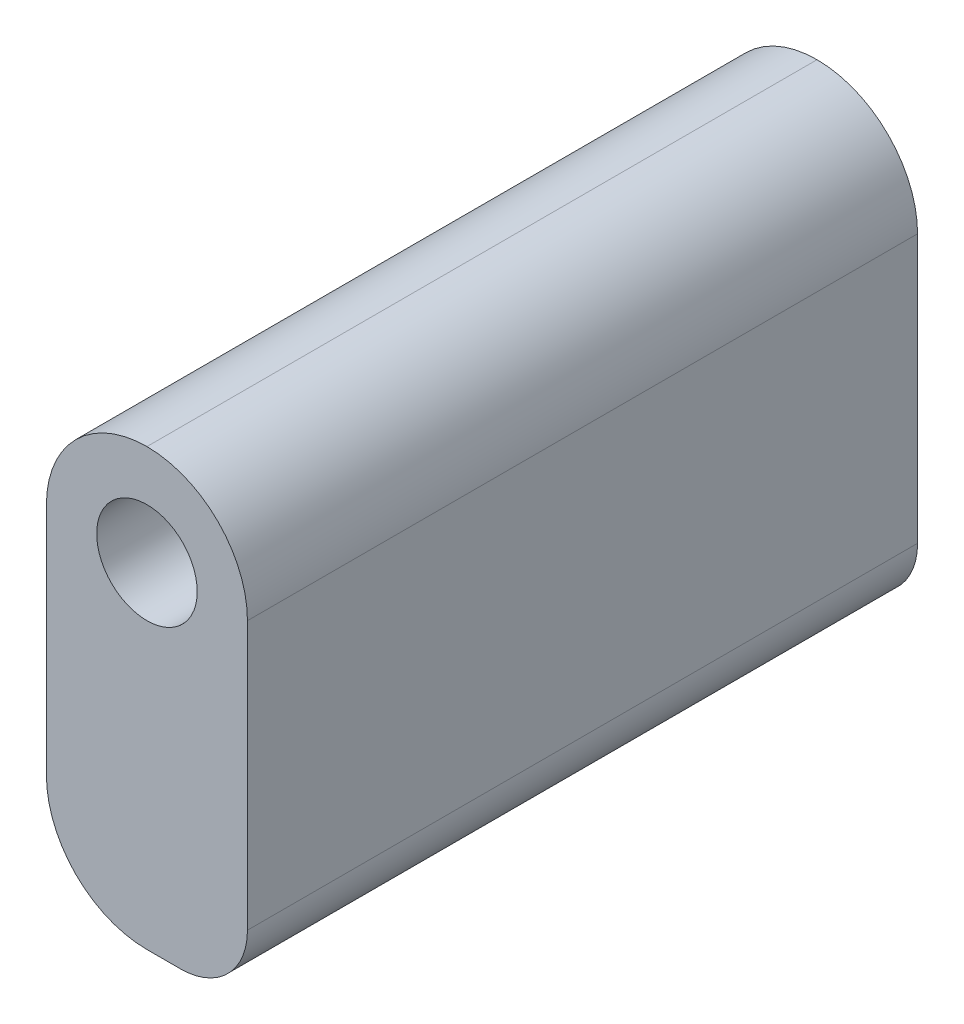
ISO-10303-21;
HEADER;
FILE_DESCRIPTION(('STEP AP214'),'2;1');
FILE_NAME('part.step','',(''),(''),'','','');
FILE_SCHEMA(('AUTOMOTIVE_DESIGN { 1 0 10303 214 1 1 1 1 }'));
ENDSEC;
DATA;
#1=APPLICATION_CONTEXT('core data for automotive mechanical design processes');
#2=APPLICATION_PROTOCOL_DEFINITION('international standard','automotive_design',2000,#1);
#3=PRODUCT_CONTEXT('',#1,'mechanical');
#4=PRODUCT('Part','Part','',(#3));
#5=PRODUCT_RELATED_PRODUCT_CATEGORY('part','',(#4));
#6=PRODUCT_DEFINITION_FORMATION('','',#4);
#7=PRODUCT_DEFINITION_CONTEXT('part definition',#1,'design');
#8=PRODUCT_DEFINITION('design','',#6,#7);
#9=PRODUCT_DEFINITION_SHAPE('','',#8);
#10=(LENGTH_UNIT() NAMED_UNIT(*) SI_UNIT(.MILLI.,.METRE.));
#11=(NAMED_UNIT(*) PLANE_ANGLE_UNIT() SI_UNIT($,.RADIAN.));
#12=(NAMED_UNIT(*) SI_UNIT($,.STERADIAN.) SOLID_ANGLE_UNIT());
#13=UNCERTAINTY_MEASURE_WITH_UNIT(LENGTH_MEASURE(1.E-05),#10,'distance_accuracy_value','');
#14=(GEOMETRIC_REPRESENTATION_CONTEXT(3) GLOBAL_UNCERTAINTY_ASSIGNED_CONTEXT((#13)) GLOBAL_UNIT_ASSIGNED_CONTEXT((#10,
#11,#12)) REPRESENTATION_CONTEXT('',''));
#15=CARTESIAN_POINT('',(0.,0.,0.));
#16=DIRECTION('',(0.,0.,1.));
#17=DIRECTION('',(1.,0.,0.));
#18=AXIS2_PLACEMENT_3D('',#15,#16,#17);
#19=CARTESIAN_POINT('',(0.,0.,20.));
#20=DIRECTION('',(0.,0.,1.));
#21=DIRECTION('',(1.,0.,0.));
#22=AXIS2_PLACEMENT_3D('',#19,#20,#21);
#23=PLANE('',#22);
#24=DIRECTION('',(1.,0.,0.));
#25=VECTOR('',#24,1.);
#26=CARTESIAN_POINT('',(-6.,-20.,20.));
#27=LINE('',#26,#25);
#28=CARTESIAN_POINT('',(0.,-20.,20.));
#29=VERTEX_POINT('',#28);
#30=CARTESIAN_POINT('',(2.,-20.,20.));
#31=VERTEX_POINT('',#30);
#32=EDGE_CURVE('E111',#29,#31,#27,.T.);
#33=ORIENTED_EDGE('',*,*,#32,.T.);
#34=CARTESIAN_POINT('',(2.,-16.,20.));
#35=DIRECTION('',(0.,0.,1.));
#36=DIRECTION('',(1.,0.,0.));
#37=AXIS2_PLACEMENT_3D('',#34,#35,#36);
#38=CIRCLE('',#37,4.);
#39=CARTESIAN_POINT('',(6.,-16.,20.));
#40=VERTEX_POINT('',#39);
#41=EDGE_CURVE('E11',#31,#40,#38,.T.);
#42=ORIENTED_EDGE('',*,*,#41,.T.);
#43=DIRECTION('',(0.,1.,0.));
#44=VECTOR('',#43,1.);
#45=CARTESIAN_POINT('',(6.,-20.,20.));
#46=LINE('',#45,#44);
#47=CARTESIAN_POINT('',(6.,0.,20.));
#48=VERTEX_POINT('',#47);
#49=EDGE_CURVE('E113',#40,#48,#46,.T.);
#50=ORIENTED_EDGE('',*,*,#49,.T.);
#51=CARTESIAN_POINT('',(0.,0.,20.));
#52=DIRECTION('',(0.,0.,1.));
#53=DIRECTION('',(1.,0.,0.));
#54=AXIS2_PLACEMENT_3D('',#51,#52,#53);
#55=CIRCLE('',#54,6.);
#56=CARTESIAN_POINT('',(0.,6.,20.));
#57=VERTEX_POINT('',#56);
#58=EDGE_CURVE('E133',#48,#57,#55,.T.);
#59=ORIENTED_EDGE('',*,*,#58,.T.);
#60=CARTESIAN_POINT('',(0.,0.,20.));
#61=DIRECTION('',(0.,0.,1.));
#62=DIRECTION('',(1.,0.,0.));
#63=AXIS2_PLACEMENT_3D('',#60,#61,#62);
#64=CIRCLE('',#63,6.);
#65=CARTESIAN_POINT('',(-6.,0.,20.));
#66=VERTEX_POINT('',#65);
#67=EDGE_CURVE('E131',#57,#66,#64,.T.);
#68=ORIENTED_EDGE('',*,*,#67,.T.);
#69=DIRECTION('',(0.,-1.,0.));
#70=VECTOR('',#69,1.);
#71=CARTESIAN_POINT('',(-6.,6.,20.));
#72=LINE('',#71,#70);
#73=CARTESIAN_POINT('',(-6.,-14.,20.));
#74=VERTEX_POINT('',#73);
#75=EDGE_CURVE('E120',#66,#74,#72,.T.);
#76=ORIENTED_EDGE('',*,*,#75,.T.);
#77=CARTESIAN_POINT('',(0.,-14.,20.));
#78=DIRECTION('',(0.,0.,1.));
#79=DIRECTION('',(1.,0.,0.));
#80=AXIS2_PLACEMENT_3D('',#77,#78,#79);
#81=CIRCLE('',#80,6.);
#82=EDGE_CURVE('E135',#74,#29,#81,.T.);
#83=ORIENTED_EDGE('',*,*,#82,.T.);
#84=EDGE_LOOP('',(#33,#42,#50,#59,#68,#76,#83));
#85=FACE_BOUND('',#84,.T.);
#86=CARTESIAN_POINT('',(0.,0.,20.));
#87=DIRECTION('',(0.,0.,1.));
#88=DIRECTION('',(1.,0.,0.));
#89=AXIS2_PLACEMENT_3D('',#86,#87,#88);
#90=CIRCLE('',#89,3.);
#91=CARTESIAN_POINT('',(3.,0.,20.));
#92=VERTEX_POINT('',#91);
#93=EDGE_CURVE('E122',#92,#92,#90,.T.);
#94=ORIENTED_EDGE('',*,*,#93,.F.);
#95=EDGE_LOOP('',(#94));
#96=FACE_BOUND('',#95,.T.);
#97=ADVANCED_FACE('F39',(#85,#96),#23,.T.);
#98=CARTESIAN_POINT('',(0.,0.,-20.));
#99=DIRECTION('',(0.,0.,1.));
#100=DIRECTION('',(1.,0.,0.));
#101=AXIS2_PLACEMENT_3D('',#98,#99,#100);
#102=PLANE('',#101);
#103=DIRECTION('',(0.,1.,0.));
#104=VECTOR('',#103,1.);
#105=CARTESIAN_POINT('',(6.,-20.,-20.));
#106=LINE('',#105,#104);
#107=CARTESIAN_POINT('',(6.,-16.,-20.));
#108=VERTEX_POINT('',#107);
#109=CARTESIAN_POINT('',(6.,0.,-20.));
#110=VERTEX_POINT('',#109);
#111=EDGE_CURVE('E117',#108,#110,#106,.T.);
#112=ORIENTED_EDGE('',*,*,#111,.F.);
#113=CARTESIAN_POINT('',(2.,-16.,-20.));
#114=DIRECTION('',(0.,0.,1.));
#115=DIRECTION('',(1.,0.,0.));
#116=AXIS2_PLACEMENT_3D('',#113,#114,#115);
#117=CIRCLE('',#116,4.);
#118=CARTESIAN_POINT('',(2.,-20.,-20.));
#119=VERTEX_POINT('',#118);
#120=EDGE_CURVE('E61',#108,#119,#117,.F.);
#121=ORIENTED_EDGE('',*,*,#120,.T.);
#122=DIRECTION('',(1.,0.,0.));
#123=VECTOR('',#122,1.);
#124=CARTESIAN_POINT('',(-6.,-20.,-20.));
#125=LINE('',#124,#123);
#126=CARTESIAN_POINT('',(0.,-20.,-20.));
#127=VERTEX_POINT('',#126);
#128=EDGE_CURVE('E110',#127,#119,#125,.T.);
#129=ORIENTED_EDGE('',*,*,#128,.F.);
#130=CARTESIAN_POINT('',(0.,-14.,-20.));
#131=DIRECTION('',(0.,0.,1.));
#132=DIRECTION('',(1.,0.,0.));
#133=AXIS2_PLACEMENT_3D('',#130,#131,#132);
#134=CIRCLE('',#133,6.);
#135=CARTESIAN_POINT('',(-6.,-14.,-20.));
#136=VERTEX_POINT('',#135);
#137=EDGE_CURVE('E98',#127,#136,#134,.F.);
#138=ORIENTED_EDGE('',*,*,#137,.T.);
#139=DIRECTION('',(0.,-1.,0.));
#140=VECTOR('',#139,1.);
#141=CARTESIAN_POINT('',(-6.,6.,-20.));
#142=LINE('',#141,#140);
#143=CARTESIAN_POINT('',(-6.,0.,-20.));
#144=VERTEX_POINT('',#143);
#145=EDGE_CURVE('E118',#144,#136,#142,.T.);
#146=ORIENTED_EDGE('',*,*,#145,.F.);
#147=CARTESIAN_POINT('',(0.,0.,-20.));
#148=DIRECTION('',(0.,0.,1.));
#149=DIRECTION('',(1.,0.,0.));
#150=AXIS2_PLACEMENT_3D('',#147,#148,#149);
#151=CIRCLE('',#150,6.);
#152=CARTESIAN_POINT('',(0.,6.,-20.));
#153=VERTEX_POINT('',#152);
#154=EDGE_CURVE('E112',#144,#153,#151,.F.);
#155=ORIENTED_EDGE('',*,*,#154,.T.);
#156=CARTESIAN_POINT('',(0.,0.,-20.));
#157=DIRECTION('',(0.,0.,1.));
#158=DIRECTION('',(1.,0.,0.));
#159=AXIS2_PLACEMENT_3D('',#156,#157,#158);
#160=CIRCLE('',#159,6.);
#161=EDGE_CURVE('E107',#153,#110,#160,.F.);
#162=ORIENTED_EDGE('',*,*,#161,.T.);
#163=EDGE_LOOP('',(#112,#121,#129,#138,#146,#155,#162));
#164=FACE_BOUND('',#163,.T.);
#165=CARTESIAN_POINT('',(0.,0.,-20.));
#166=DIRECTION('',(0.,0.,1.));
#167=DIRECTION('',(1.,0.,0.));
#168=AXIS2_PLACEMENT_3D('',#165,#166,#167);
#169=CIRCLE('',#168,3.);
#170=CARTESIAN_POINT('',(3.,0.,-20.));
#171=VERTEX_POINT('',#170);
#172=EDGE_CURVE('E144',#171,#171,#169,.T.);
#173=ORIENTED_EDGE('',*,*,#172,.T.);
#174=EDGE_LOOP('',(#173));
#175=FACE_BOUND('',#174,.T.);
#176=ADVANCED_FACE('F115',(#164,#175),#102,.F.);
#177=CARTESIAN_POINT('',(-6.,6.,20.));
#178=DIRECTION('',(1.,0.,0.));
#179=DIRECTION('',(0.,1.,0.));
#180=AXIS2_PLACEMENT_3D('',#177,#178,#179);
#181=PLANE('',#180);
#182=ORIENTED_EDGE('',*,*,#145,.T.);
#183=DIRECTION('',(0.,0.,-1.));
#184=VECTOR('',#183,1.);
#185=CARTESIAN_POINT('',(-6.,-14.,20.));
#186=LINE('',#185,#184);
#187=EDGE_CURVE('E103',#136,#74,#186,.F.);
#188=ORIENTED_EDGE('',*,*,#187,.T.);
#189=ORIENTED_EDGE('',*,*,#75,.F.);
#190=DIRECTION('',(0.,0.,-1.));
#191=VECTOR('',#190,1.);
#192=CARTESIAN_POINT('',(-6.,0.,20.));
#193=LINE('',#192,#191);
#194=EDGE_CURVE('E106',#66,#144,#193,.T.);
#195=ORIENTED_EDGE('',*,*,#194,.T.);
#196=EDGE_LOOP('',(#182,#188,#189,#195));
#197=FACE_BOUND('',#196,.T.);
#198=ADVANCED_FACE('F169',(#197),#181,.F.);
#199=CARTESIAN_POINT('',(-6.,-20.,20.));
#200=DIRECTION('',(0.,1.,0.));
#201=DIRECTION('',(0.,0.,1.));
#202=AXIS2_PLACEMENT_3D('',#199,#200,#201);
#203=PLANE('',#202);
#204=ORIENTED_EDGE('',*,*,#128,.T.);
#205=DIRECTION('',(0.,0.,-1.));
#206=VECTOR('',#205,1.);
#207=CARTESIAN_POINT('',(2.,-20.,20.));
#208=LINE('',#207,#206);
#209=EDGE_CURVE('E47',#119,#31,#208,.F.);
#210=ORIENTED_EDGE('',*,*,#209,.T.);
#211=ORIENTED_EDGE('',*,*,#32,.F.);
#212=DIRECTION('',(0.,0.,-1.));
#213=VECTOR('',#212,1.);
#214=CARTESIAN_POINT('',(0.,-20.,20.));
#215=LINE('',#214,#213);
#216=EDGE_CURVE('E102',#29,#127,#215,.T.);
#217=ORIENTED_EDGE('',*,*,#216,.T.);
#218=EDGE_LOOP('',(#204,#210,#211,#217));
#219=FACE_BOUND('',#218,.T.);
#220=ADVANCED_FACE('F109',(#219),#203,.F.);
#221=CARTESIAN_POINT('',(6.,-20.,20.));
#222=DIRECTION('',(-1.,0.,0.));
#223=DIRECTION('',(0.,-1.,0.));
#224=AXIS2_PLACEMENT_3D('',#221,#222,#223);
#225=PLANE('',#224);
#226=ORIENTED_EDGE('',*,*,#49,.F.);
#227=DIRECTION('',(0.,0.,-1.));
#228=VECTOR('',#227,1.);
#229=CARTESIAN_POINT('',(6.,-16.,20.));
#230=LINE('',#229,#228);
#231=EDGE_CURVE('E140',#40,#108,#230,.T.);
#232=ORIENTED_EDGE('',*,*,#231,.T.);
#233=ORIENTED_EDGE('',*,*,#111,.T.);
#234=DIRECTION('',(0.,0.,-1.));
#235=VECTOR('',#234,1.);
#236=CARTESIAN_POINT('',(6.,0.,20.));
#237=LINE('',#236,#235);
#238=EDGE_CURVE('E137',#110,#48,#237,.F.);
#239=ORIENTED_EDGE('',*,*,#238,.T.);
#240=EDGE_LOOP('',(#226,#232,#233,#239));
#241=FACE_BOUND('',#240,.T.);
#242=ADVANCED_FACE('F150',(#241),#225,.F.);
#243=CARTESIAN_POINT('',(0.,0.,20.));
#244=DIRECTION('',(0.,0.,-1.));
#245=DIRECTION('',(-1.,0.,0.));
#246=AXIS2_PLACEMENT_3D('',#243,#244,#245);
#247=CYLINDRICAL_SURFACE('',#246,3.);
#248=ORIENTED_EDGE('',*,*,#93,.T.);
#249=EDGE_LOOP('',(#248));
#250=FACE_BOUND('',#249,.T.);
#251=ORIENTED_EDGE('',*,*,#172,.F.);
#252=EDGE_LOOP('',(#251));
#253=FACE_BOUND('',#252,.T.);
#254=ADVANCED_FACE('F178',(#250,#253),#247,.F.);
#255=CARTESIAN_POINT('',(0.,-14.,20.));
#256=DIRECTION('',(0.,0.,-1.));
#257=DIRECTION('',(-1.,0.,0.));
#258=AXIS2_PLACEMENT_3D('',#255,#256,#257);
#259=CYLINDRICAL_SURFACE('',#258,6.);
#260=ORIENTED_EDGE('',*,*,#82,.F.);
#261=ORIENTED_EDGE('',*,*,#187,.F.);
#262=ORIENTED_EDGE('',*,*,#137,.F.);
#263=ORIENTED_EDGE('',*,*,#216,.F.);
#264=EDGE_LOOP('',(#260,#261,#262,#263));
#265=FACE_BOUND('',#264,.T.);
#266=ADVANCED_FACE('F101',(#265),#259,.T.);
#267=CARTESIAN_POINT('',(0.,0.,20.));
#268=DIRECTION('',(0.,0.,-1.));
#269=DIRECTION('',(-1.,0.,0.));
#270=AXIS2_PLACEMENT_3D('',#267,#268,#269);
#271=CYLINDRICAL_SURFACE('',#270,6.);
#272=ORIENTED_EDGE('',*,*,#194,.F.);
#273=ORIENTED_EDGE('',*,*,#67,.F.);
#274=DIRECTION('',(0.,0.,-1.));
#275=VECTOR('',#274,1.);
#276=CARTESIAN_POINT('',(0.,6.,20.));
#277=LINE('',#276,#275);
#278=EDGE_CURVE('E141',#153,#57,#277,.F.);
#279=ORIENTED_EDGE('',*,*,#278,.F.);
#280=ORIENTED_EDGE('',*,*,#154,.F.);
#281=EDGE_LOOP('',(#272,#273,#279,#280));
#282=FACE_BOUND('',#281,.T.);
#283=ADVANCED_FACE('F167',(#282),#271,.T.);
#284=CARTESIAN_POINT('',(0.,0.,20.));
#285=DIRECTION('',(0.,0.,-1.));
#286=DIRECTION('',(-1.,0.,0.));
#287=AXIS2_PLACEMENT_3D('',#284,#285,#286);
#288=CYLINDRICAL_SURFACE('',#287,6.);
#289=ORIENTED_EDGE('',*,*,#58,.F.);
#290=ORIENTED_EDGE('',*,*,#238,.F.);
#291=ORIENTED_EDGE('',*,*,#161,.F.);
#292=ORIENTED_EDGE('',*,*,#278,.T.);
#293=EDGE_LOOP('',(#289,#290,#291,#292));
#294=FACE_BOUND('',#293,.T.);
#295=ADVANCED_FACE('F159',(#294),#288,.T.);
#296=CARTESIAN_POINT('',(2.,-16.,20.));
#297=DIRECTION('',(0.,0.,-1.));
#298=DIRECTION('',(-1.,0.,0.));
#299=AXIS2_PLACEMENT_3D('',#296,#297,#298);
#300=CYLINDRICAL_SURFACE('',#299,4.);
#301=ORIENTED_EDGE('',*,*,#41,.F.);
#302=ORIENTED_EDGE('',*,*,#209,.F.);
#303=ORIENTED_EDGE('',*,*,#120,.F.);
#304=ORIENTED_EDGE('',*,*,#231,.F.);
#305=EDGE_LOOP('',(#301,#302,#303,#304));
#306=FACE_BOUND('',#305,.T.);
#307=ADVANCED_FACE('F41',(#306),#300,.T.);
#308=CLOSED_SHELL('',(#97,#176,#198,#220,#242,#254,#266,#283,#295,#307));
#309=MANIFOLD_SOLID_BREP('B2',#308);
#310=ADVANCED_BREP_SHAPE_REPRESENTATION('',(#18,#309),#14);
#311=SHAPE_DEFINITION_REPRESENTATION(#9,#310);
ENDSEC;
END-ISO-10303-21;
